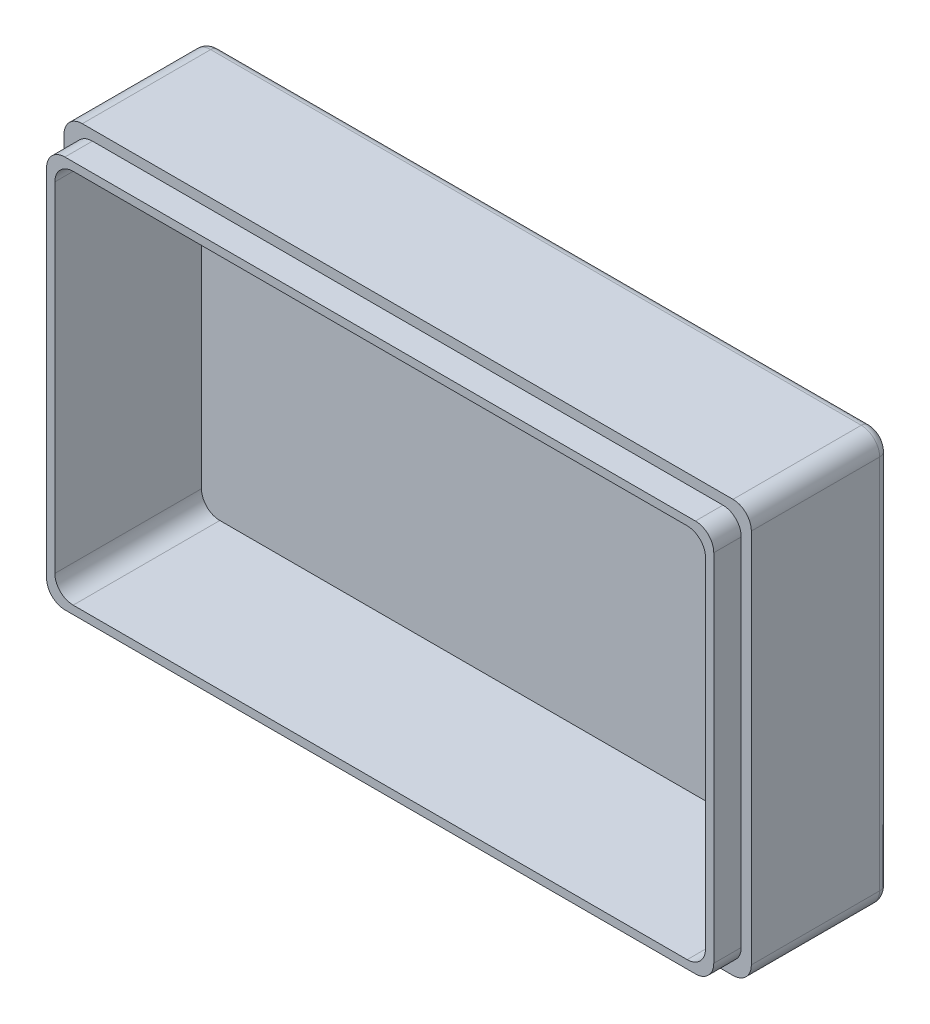
ISO-10303-21;
HEADER;
FILE_DESCRIPTION(('STEP AP214'),'2;1');
FILE_NAME('part.step','',(''),(''),'','','');
FILE_SCHEMA(('AUTOMOTIVE_DESIGN { 1 0 10303 214 1 1 1 1 }'));
ENDSEC;
DATA;
#1=APPLICATION_CONTEXT('core data for automotive mechanical design processes');
#2=APPLICATION_PROTOCOL_DEFINITION('international standard','automotive_design',2000,#1);
#3=PRODUCT_CONTEXT('',#1,'mechanical');
#4=PRODUCT('Part','Part','',(#3));
#5=PRODUCT_RELATED_PRODUCT_CATEGORY('part','',(#4));
#6=PRODUCT_DEFINITION_FORMATION('','',#4);
#7=PRODUCT_DEFINITION_CONTEXT('part definition',#1,'design');
#8=PRODUCT_DEFINITION('design','',#6,#7);
#9=PRODUCT_DEFINITION_SHAPE('','',#8);
#10=(LENGTH_UNIT() NAMED_UNIT(*) SI_UNIT(.MILLI.,.METRE.));
#11=(NAMED_UNIT(*) PLANE_ANGLE_UNIT() SI_UNIT($,.RADIAN.));
#12=(NAMED_UNIT(*) SI_UNIT($,.STERADIAN.) SOLID_ANGLE_UNIT());
#13=UNCERTAINTY_MEASURE_WITH_UNIT(LENGTH_MEASURE(1.E-05),#10,'distance_accuracy_value','');
#14=(GEOMETRIC_REPRESENTATION_CONTEXT(3) GLOBAL_UNCERTAINTY_ASSIGNED_CONTEXT((#13)) GLOBAL_UNIT_ASSIGNED_CONTEXT((#10,
#11,#12)) REPRESENTATION_CONTEXT('',''));
#15=CARTESIAN_POINT('',(0.,0.,0.));
#16=DIRECTION('',(0.,0.,1.));
#17=DIRECTION('',(1.,0.,0.));
#18=AXIS2_PLACEMENT_3D('',#15,#16,#17);
#19=CARTESIAN_POINT('',(0.,0.,18.));
#20=DIRECTION('',(0.,0.,1.));
#21=DIRECTION('',(1.,0.,0.));
#22=AXIS2_PLACEMENT_3D('',#19,#20,#21);
#23=PLANE('',#22);
#24=DIRECTION('',(-1.,0.,0.));
#25=VECTOR('',#24,1.);
#26=CARTESIAN_POINT('',(35.5,20.5,18.));
#27=LINE('',#26,#25);
#28=CARTESIAN_POINT('',(33.5,20.5,18.));
#29=VERTEX_POINT('',#28);
#30=CARTESIAN_POINT('',(-33.5,20.5,18.));
#31=VERTEX_POINT('',#30);
#32=EDGE_CURVE('E242',#29,#31,#27,.T.);
#33=ORIENTED_EDGE('',*,*,#32,.F.);
#34=CARTESIAN_POINT('',(33.5,18.5,18.));
#35=DIRECTION('',(0.,0.,1.));
#36=DIRECTION('',(1.,0.,0.));
#37=AXIS2_PLACEMENT_3D('',#34,#35,#36);
#38=CIRCLE('',#37,2.);
#39=CARTESIAN_POINT('',(35.5,18.5,18.));
#40=VERTEX_POINT('',#39);
#41=EDGE_CURVE('E225',#29,#40,#38,.F.);
#42=ORIENTED_EDGE('',*,*,#41,.T.);
#43=DIRECTION('',(0.,1.,0.));
#44=VECTOR('',#43,1.);
#45=CARTESIAN_POINT('',(35.5,-20.5,18.));
#46=LINE('',#45,#44);
#47=CARTESIAN_POINT('',(35.5,-18.5,18.));
#48=VERTEX_POINT('',#47);
#49=EDGE_CURVE('E266',#48,#40,#46,.T.);
#50=ORIENTED_EDGE('',*,*,#49,.F.);
#51=CARTESIAN_POINT('',(33.5,-18.5,18.));
#52=DIRECTION('',(0.,0.,1.));
#53=DIRECTION('',(1.,0.,0.));
#54=AXIS2_PLACEMENT_3D('',#51,#52,#53);
#55=CIRCLE('',#54,2.);
#56=CARTESIAN_POINT('',(33.5,-20.5,18.));
#57=VERTEX_POINT('',#56);
#58=EDGE_CURVE('E346',#48,#57,#55,.F.);
#59=ORIENTED_EDGE('',*,*,#58,.T.);
#60=DIRECTION('',(1.,0.,0.));
#61=VECTOR('',#60,1.);
#62=CARTESIAN_POINT('',(-35.5,-20.5,18.));
#63=LINE('',#62,#61);
#64=CARTESIAN_POINT('',(-33.5,-20.5,18.));
#65=VERTEX_POINT('',#64);
#66=EDGE_CURVE('E255',#65,#57,#63,.T.);
#67=ORIENTED_EDGE('',*,*,#66,.F.);
#68=CARTESIAN_POINT('',(-33.5,-18.5,18.));
#69=DIRECTION('',(0.,0.,1.));
#70=DIRECTION('',(1.,0.,0.));
#71=AXIS2_PLACEMENT_3D('',#68,#69,#70);
#72=CIRCLE('',#71,2.);
#73=CARTESIAN_POINT('',(-35.5,-18.5,18.));
#74=VERTEX_POINT('',#73);
#75=EDGE_CURVE('E344',#65,#74,#72,.F.);
#76=ORIENTED_EDGE('',*,*,#75,.T.);
#77=DIRECTION('',(0.,-1.,0.));
#78=VECTOR('',#77,1.);
#79=CARTESIAN_POINT('',(-35.5,20.5,18.));
#80=LINE('',#79,#78);
#81=CARTESIAN_POINT('',(-35.5,18.5,18.));
#82=VERTEX_POINT('',#81);
#83=EDGE_CURVE('E251',#82,#74,#80,.T.);
#84=ORIENTED_EDGE('',*,*,#83,.F.);
#85=CARTESIAN_POINT('',(-33.5,18.5,18.));
#86=DIRECTION('',(0.,0.,1.));
#87=DIRECTION('',(1.,0.,0.));
#88=AXIS2_PLACEMENT_3D('',#85,#86,#87);
#89=CIRCLE('',#88,2.);
#90=EDGE_CURVE('E235',#82,#31,#89,.F.);
#91=ORIENTED_EDGE('',*,*,#90,.T.);
#92=EDGE_LOOP('',(#33,#42,#50,#59,#67,#76,#84,#91));
#93=FACE_BOUND('',#92,.T.);
#94=DIRECTION('',(0.,1.,0.));
#95=VECTOR('',#94,1.);
#96=CARTESIAN_POINT('',(36.4,-21.4,18.));
#97=LINE('',#96,#95);
#98=CARTESIAN_POINT('',(36.4,-19.4,18.));
#99=VERTEX_POINT('',#98);
#100=CARTESIAN_POINT('',(36.4,19.4,18.));
#101=VERTEX_POINT('',#100);
#102=EDGE_CURVE('E417',#99,#101,#97,.T.);
#103=ORIENTED_EDGE('',*,*,#102,.T.);
#104=CARTESIAN_POINT('',(34.4,19.4,18.));
#105=DIRECTION('',(0.,0.,1.));
#106=DIRECTION('',(1.,0.,0.));
#107=AXIS2_PLACEMENT_3D('',#104,#105,#106);
#108=CIRCLE('',#107,2.);
#109=CARTESIAN_POINT('',(34.4,21.4,18.));
#110=VERTEX_POINT('',#109);
#111=EDGE_CURVE('E301',#101,#110,#108,.T.);
#112=ORIENTED_EDGE('',*,*,#111,.T.);
#113=DIRECTION('',(-1.,0.,0.));
#114=VECTOR('',#113,1.);
#115=CARTESIAN_POINT('',(36.4,21.4,18.));
#116=LINE('',#115,#114);
#117=CARTESIAN_POINT('',(-34.4,21.4,18.));
#118=VERTEX_POINT('',#117);
#119=EDGE_CURVE('E425',#110,#118,#116,.T.);
#120=ORIENTED_EDGE('',*,*,#119,.T.);
#121=CARTESIAN_POINT('',(-34.4,19.4,18.));
#122=DIRECTION('',(0.,0.,1.));
#123=DIRECTION('',(1.,0.,0.));
#124=AXIS2_PLACEMENT_3D('',#121,#122,#123);
#125=CIRCLE('',#124,2.);
#126=CARTESIAN_POINT('',(-36.4,19.4,18.));
#127=VERTEX_POINT('',#126);
#128=EDGE_CURVE('E295',#118,#127,#125,.T.);
#129=ORIENTED_EDGE('',*,*,#128,.T.);
#130=DIRECTION('',(0.,-1.,0.));
#131=VECTOR('',#130,1.);
#132=CARTESIAN_POINT('',(-36.4,21.4,18.));
#133=LINE('',#132,#131);
#134=CARTESIAN_POINT('',(-36.4,-19.4,18.));
#135=VERTEX_POINT('',#134);
#136=EDGE_CURVE('E407',#127,#135,#133,.T.);
#137=ORIENTED_EDGE('',*,*,#136,.T.);
#138=CARTESIAN_POINT('',(-34.4,-19.4,18.));
#139=DIRECTION('',(0.,0.,1.));
#140=DIRECTION('',(1.,0.,0.));
#141=AXIS2_PLACEMENT_3D('',#138,#139,#140);
#142=CIRCLE('',#141,2.);
#143=CARTESIAN_POINT('',(-34.4,-21.4,18.));
#144=VERTEX_POINT('',#143);
#145=EDGE_CURVE('E297',#135,#144,#142,.T.);
#146=ORIENTED_EDGE('',*,*,#145,.T.);
#147=DIRECTION('',(1.,0.,0.));
#148=VECTOR('',#147,1.);
#149=CARTESIAN_POINT('',(-36.4,-21.4,18.));
#150=LINE('',#149,#148);
#151=CARTESIAN_POINT('',(34.4,-21.4,18.));
#152=VERTEX_POINT('',#151);
#153=EDGE_CURVE('E413',#144,#152,#150,.T.);
#154=ORIENTED_EDGE('',*,*,#153,.T.);
#155=CARTESIAN_POINT('',(34.4,-19.4,18.));
#156=DIRECTION('',(0.,0.,1.));
#157=DIRECTION('',(1.,0.,0.));
#158=AXIS2_PLACEMENT_3D('',#155,#156,#157);
#159=CIRCLE('',#158,2.);
#160=EDGE_CURVE('E299',#152,#99,#159,.T.);
#161=ORIENTED_EDGE('',*,*,#160,.T.);
#162=EDGE_LOOP('',(#103,#112,#120,#129,#137,#146,#154,#161));
#163=FACE_BOUND('',#162,.T.);
#164=ADVANCED_FACE('F38',(#93,#163),#23,.T.);
#165=CARTESIAN_POINT('',(35.5,20.5,2.));
#166=DIRECTION('',(0.,1.,0.));
#167=DIRECTION('',(0.,0.,1.));
#168=AXIS2_PLACEMENT_3D('',#165,#166,#167);
#169=PLANE('',#168);
#170=DIRECTION('',(-1.,0.,0.));
#171=VECTOR('',#170,1.);
#172=CARTESIAN_POINT('',(35.5,20.5,2.));
#173=LINE('',#172,#171);
#174=CARTESIAN_POINT('',(33.5,20.5,2.));
#175=VERTEX_POINT('',#174);
#176=CARTESIAN_POINT('',(-33.5,20.5,2.));
#177=VERTEX_POINT('',#176);
#178=EDGE_CURVE('E245',#175,#177,#173,.T.);
#179=ORIENTED_EDGE('',*,*,#178,.F.);
#180=DIRECTION('',(0.,0.,1.));
#181=VECTOR('',#180,1.);
#182=CARTESIAN_POINT('',(33.5,20.5,18.));
#183=LINE('',#182,#181);
#184=EDGE_CURVE('E229',#175,#29,#183,.T.);
#185=ORIENTED_EDGE('',*,*,#184,.T.);
#186=ORIENTED_EDGE('',*,*,#32,.T.);
#187=DIRECTION('',(0.,0.,1.));
#188=VECTOR('',#187,1.);
#189=CARTESIAN_POINT('',(-33.5,20.5,2.));
#190=LINE('',#189,#188);
#191=EDGE_CURVE('E247',#31,#177,#190,.F.);
#192=ORIENTED_EDGE('',*,*,#191,.T.);
#193=EDGE_LOOP('',(#179,#185,#186,#192));
#194=FACE_BOUND('',#193,.T.);
#195=ADVANCED_FACE('F241',(#194),#169,.F.);
#196=CARTESIAN_POINT('',(35.5,-20.5,2.));
#197=DIRECTION('',(1.,0.,0.));
#198=DIRECTION('',(0.,0.,-1.));
#199=AXIS2_PLACEMENT_3D('',#196,#197,#198);
#200=PLANE('',#199);
#201=ORIENTED_EDGE('',*,*,#49,.T.);
#202=DIRECTION('',(0.,0.,1.));
#203=VECTOR('',#202,1.);
#204=CARTESIAN_POINT('',(35.5,18.5,2.));
#205=LINE('',#204,#203);
#206=CARTESIAN_POINT('',(35.5,18.5,2.));
#207=VERTEX_POINT('',#206);
#208=EDGE_CURVE('E230',#40,#207,#205,.F.);
#209=ORIENTED_EDGE('',*,*,#208,.T.);
#210=DIRECTION('',(0.,1.,0.));
#211=VECTOR('',#210,1.);
#212=CARTESIAN_POINT('',(35.5,-20.5,2.));
#213=LINE('',#212,#211);
#214=CARTESIAN_POINT('',(35.5,-18.5,2.));
#215=VERTEX_POINT('',#214);
#216=EDGE_CURVE('E261',#215,#207,#213,.T.);
#217=ORIENTED_EDGE('',*,*,#216,.F.);
#218=DIRECTION('',(0.,0.,1.));
#219=VECTOR('',#218,1.);
#220=CARTESIAN_POINT('',(35.5,-18.5,18.));
#221=LINE('',#220,#219);
#222=EDGE_CURVE('E246',#215,#48,#221,.T.);
#223=ORIENTED_EDGE('',*,*,#222,.T.);
#224=EDGE_LOOP('',(#201,#209,#217,#223));
#225=FACE_BOUND('',#224,.T.);
#226=ADVANCED_FACE('F450',(#225),#200,.F.);
#227=CARTESIAN_POINT('',(-35.5,-20.5,2.));
#228=DIRECTION('',(0.,-1.,0.));
#229=DIRECTION('',(0.,0.,-1.));
#230=AXIS2_PLACEMENT_3D('',#227,#228,#229);
#231=PLANE('',#230);
#232=DIRECTION('',(1.,0.,0.));
#233=VECTOR('',#232,1.);
#234=CARTESIAN_POINT('',(-35.5,-20.5,2.));
#235=LINE('',#234,#233);
#236=CARTESIAN_POINT('',(-33.5,-20.5,2.));
#237=VERTEX_POINT('',#236);
#238=CARTESIAN_POINT('',(33.5,-20.5,2.));
#239=VERTEX_POINT('',#238);
#240=EDGE_CURVE('E440',#237,#239,#235,.T.);
#241=ORIENTED_EDGE('',*,*,#240,.F.);
#242=DIRECTION('',(0.,0.,1.));
#243=VECTOR('',#242,1.);
#244=CARTESIAN_POINT('',(-33.5,-20.5,18.));
#245=LINE('',#244,#243);
#246=EDGE_CURVE('E287',#237,#65,#245,.T.);
#247=ORIENTED_EDGE('',*,*,#246,.T.);
#248=ORIENTED_EDGE('',*,*,#66,.T.);
#249=DIRECTION('',(0.,0.,1.));
#250=VECTOR('',#249,1.);
#251=CARTESIAN_POINT('',(33.5,-20.5,2.));
#252=LINE('',#251,#250);
#253=EDGE_CURVE('E285',#57,#239,#252,.F.);
#254=ORIENTED_EDGE('',*,*,#253,.T.);
#255=EDGE_LOOP('',(#241,#247,#248,#254));
#256=FACE_BOUND('',#255,.T.);
#257=ADVANCED_FACE('F456',(#256),#231,.F.);
#258=CARTESIAN_POINT('',(-35.5,20.5,2.));
#259=DIRECTION('',(-1.,0.,0.));
#260=DIRECTION('',(0.,0.,1.));
#261=AXIS2_PLACEMENT_3D('',#258,#259,#260);
#262=PLANE('',#261);
#263=DIRECTION('',(0.,-1.,0.));
#264=VECTOR('',#263,1.);
#265=CARTESIAN_POINT('',(-35.5,20.5,2.));
#266=LINE('',#265,#264);
#267=CARTESIAN_POINT('',(-35.5,18.5,2.));
#268=VERTEX_POINT('',#267);
#269=CARTESIAN_POINT('',(-35.5,-18.5,2.));
#270=VERTEX_POINT('',#269);
#271=EDGE_CURVE('E438',#268,#270,#266,.T.);
#272=ORIENTED_EDGE('',*,*,#271,.F.);
#273=DIRECTION('',(0.,0.,1.));
#274=VECTOR('',#273,1.);
#275=CARTESIAN_POINT('',(-35.5,18.5,18.));
#276=LINE('',#275,#274);
#277=EDGE_CURVE('E282',#268,#82,#276,.T.);
#278=ORIENTED_EDGE('',*,*,#277,.T.);
#279=ORIENTED_EDGE('',*,*,#83,.T.);
#280=DIRECTION('',(0.,0.,1.));
#281=VECTOR('',#280,1.);
#282=CARTESIAN_POINT('',(-35.5,-18.5,2.));
#283=LINE('',#282,#281);
#284=EDGE_CURVE('E280',#74,#270,#283,.F.);
#285=ORIENTED_EDGE('',*,*,#284,.T.);
#286=EDGE_LOOP('',(#272,#278,#279,#285));
#287=FACE_BOUND('',#286,.T.);
#288=ADVANCED_FACE('F464',(#287),#262,.F.);
#289=CARTESIAN_POINT('',(0.,0.,2.));
#290=DIRECTION('',(0.,0.,1.));
#291=DIRECTION('',(1.,0.,0.));
#292=AXIS2_PLACEMENT_3D('',#289,#290,#291);
#293=PLANE('',#292);
#294=ORIENTED_EDGE('',*,*,#216,.T.);
#295=CARTESIAN_POINT('',(33.5,18.5,2.));
#296=DIRECTION('',(0.,0.,1.));
#297=DIRECTION('',(1.,0.,0.));
#298=AXIS2_PLACEMENT_3D('',#295,#296,#297);
#299=CIRCLE('',#298,2.);
#300=EDGE_CURVE('E278',#207,#175,#299,.T.);
#301=ORIENTED_EDGE('',*,*,#300,.T.);
#302=ORIENTED_EDGE('',*,*,#178,.T.);
#303=CARTESIAN_POINT('',(-33.5,18.5,2.));
#304=DIRECTION('',(0.,0.,1.));
#305=DIRECTION('',(1.,0.,0.));
#306=AXIS2_PLACEMENT_3D('',#303,#304,#305);
#307=CIRCLE('',#306,2.);
#308=EDGE_CURVE('E276',#177,#268,#307,.T.);
#309=ORIENTED_EDGE('',*,*,#308,.T.);
#310=ORIENTED_EDGE('',*,*,#271,.T.);
#311=CARTESIAN_POINT('',(-33.5,-18.5,2.));
#312=DIRECTION('',(0.,0.,1.));
#313=DIRECTION('',(1.,0.,0.));
#314=AXIS2_PLACEMENT_3D('',#311,#312,#313);
#315=CIRCLE('',#314,2.);
#316=EDGE_CURVE('E274',#270,#237,#315,.T.);
#317=ORIENTED_EDGE('',*,*,#316,.T.);
#318=ORIENTED_EDGE('',*,*,#240,.T.);
#319=CARTESIAN_POINT('',(33.5,-18.5,2.));
#320=DIRECTION('',(0.,0.,1.));
#321=DIRECTION('',(1.,0.,0.));
#322=AXIS2_PLACEMENT_3D('',#319,#320,#321);
#323=CIRCLE('',#322,2.);
#324=EDGE_CURVE('E272',#239,#215,#323,.T.);
#325=ORIENTED_EDGE('',*,*,#324,.T.);
#326=EDGE_LOOP('',(#294,#301,#302,#309,#310,#317,#318,#325));
#327=FACE_BOUND('',#326,.T.);
#328=ADVANCED_FACE('F447',(#327),#293,.T.);
#329=CARTESIAN_POINT('',(0.,0.,15.));
#330=DIRECTION('',(0.,0.,1.));
#331=DIRECTION('',(1.,0.,0.));
#332=AXIS2_PLACEMENT_3D('',#329,#330,#331);
#333=PLANE('',#332);
#334=DIRECTION('',(-1.,0.,0.));
#335=VECTOR('',#334,1.);
#336=CARTESIAN_POINT('',(36.4,21.4,15.));
#337=LINE('',#336,#335);
#338=CARTESIAN_POINT('',(34.4,21.4,15.));
#339=VERTEX_POINT('',#338);
#340=CARTESIAN_POINT('',(-34.4,21.4,15.));
#341=VERTEX_POINT('',#340);
#342=EDGE_CURVE('E420',#339,#341,#337,.T.);
#343=ORIENTED_EDGE('',*,*,#342,.F.);
#344=CARTESIAN_POINT('',(34.4,19.4,15.));
#345=DIRECTION('',(0.,0.,1.));
#346=DIRECTION('',(1.,0.,0.));
#347=AXIS2_PLACEMENT_3D('',#344,#345,#346);
#348=CIRCLE('',#347,2.);
#349=CARTESIAN_POINT('',(36.4,19.4,15.));
#350=VERTEX_POINT('',#349);
#351=EDGE_CURVE('E348',#339,#350,#348,.F.);
#352=ORIENTED_EDGE('',*,*,#351,.T.);
#353=DIRECTION('',(0.,1.,0.));
#354=VECTOR('',#353,1.);
#355=CARTESIAN_POINT('',(36.4,-21.4,15.));
#356=LINE('',#355,#354);
#357=CARTESIAN_POINT('',(36.4,-19.4,15.));
#358=VERTEX_POINT('',#357);
#359=EDGE_CURVE('E849',#358,#350,#356,.T.);
#360=ORIENTED_EDGE('',*,*,#359,.F.);
#361=CARTESIAN_POINT('',(34.4,-19.4,15.));
#362=DIRECTION('',(0.,0.,1.));
#363=DIRECTION('',(1.,0.,0.));
#364=AXIS2_PLACEMENT_3D('',#361,#362,#363);
#365=CIRCLE('',#364,2.);
#366=CARTESIAN_POINT('',(34.4,-21.4,15.));
#367=VERTEX_POINT('',#366);
#368=EDGE_CURVE('E350',#358,#367,#365,.F.);
#369=ORIENTED_EDGE('',*,*,#368,.T.);
#370=DIRECTION('',(1.,0.,0.));
#371=VECTOR('',#370,1.);
#372=CARTESIAN_POINT('',(-36.4,-21.4,15.));
#373=LINE('',#372,#371);
#374=CARTESIAN_POINT('',(-34.4,-21.4,15.));
#375=VERTEX_POINT('',#374);
#376=EDGE_CURVE('E861',#375,#367,#373,.T.);
#377=ORIENTED_EDGE('',*,*,#376,.F.);
#378=CARTESIAN_POINT('',(-34.4,-19.4,15.));
#379=DIRECTION('',(0.,0.,1.));
#380=DIRECTION('',(1.,0.,0.));
#381=AXIS2_PLACEMENT_3D('',#378,#379,#380);
#382=CIRCLE('',#381,2.);
#383=CARTESIAN_POINT('',(-36.4,-19.4,15.));
#384=VERTEX_POINT('',#383);
#385=EDGE_CURVE('E352',#375,#384,#382,.F.);
#386=ORIENTED_EDGE('',*,*,#385,.T.);
#387=DIRECTION('',(0.,-1.,0.));
#388=VECTOR('',#387,1.);
#389=CARTESIAN_POINT('',(-36.4,21.4,15.));
#390=LINE('',#389,#388);
#391=CARTESIAN_POINT('',(-36.4,19.4,15.));
#392=VERTEX_POINT('',#391);
#393=EDGE_CURVE('E428',#392,#384,#390,.T.);
#394=ORIENTED_EDGE('',*,*,#393,.F.);
#395=CARTESIAN_POINT('',(-34.4,19.4,15.));
#396=DIRECTION('',(0.,0.,1.));
#397=DIRECTION('',(1.,0.,0.));
#398=AXIS2_PLACEMENT_3D('',#395,#396,#397);
#399=CIRCLE('',#398,2.);
#400=EDGE_CURVE('E354',#392,#341,#399,.F.);
#401=ORIENTED_EDGE('',*,*,#400,.T.);
#402=EDGE_LOOP('',(#343,#352,#360,#369,#377,#386,#394,#401));
#403=FACE_BOUND('',#402,.T.);
#404=DIRECTION('',(0.,1.,0.));
#405=VECTOR('',#404,1.);
#406=CARTESIAN_POINT('',(37.5,-22.5,15.));
#407=LINE('',#406,#405);
#408=CARTESIAN_POINT('',(37.5,-20.5,15.));
#409=VERTEX_POINT('',#408);
#410=CARTESIAN_POINT('',(37.5,20.5,15.));
#411=VERTEX_POINT('',#410);
#412=EDGE_CURVE('E258',#409,#411,#407,.T.);
#413=ORIENTED_EDGE('',*,*,#412,.T.);
#414=CARTESIAN_POINT('',(35.5,20.5,15.));
#415=DIRECTION('',(0.,0.,1.));
#416=DIRECTION('',(1.,0.,0.));
#417=AXIS2_PLACEMENT_3D('',#414,#415,#416);
#418=CIRCLE('',#417,2.);
#419=CARTESIAN_POINT('',(35.5,22.5,15.));
#420=VERTEX_POINT('',#419);
#421=EDGE_CURVE('E322',#411,#420,#418,.T.);
#422=ORIENTED_EDGE('',*,*,#421,.T.);
#423=DIRECTION('',(-1.,0.,0.));
#424=VECTOR('',#423,1.);
#425=CARTESIAN_POINT('',(37.5,22.5,15.));
#426=LINE('',#425,#424);
#427=CARTESIAN_POINT('',(-35.5,22.5,15.));
#428=VERTEX_POINT('',#427);
#429=EDGE_CURVE('E252',#420,#428,#426,.T.);
#430=ORIENTED_EDGE('',*,*,#429,.T.);
#431=CARTESIAN_POINT('',(-35.5,20.5,15.));
#432=DIRECTION('',(0.,0.,1.));
#433=DIRECTION('',(1.,0.,0.));
#434=AXIS2_PLACEMENT_3D('',#431,#432,#433);
#435=CIRCLE('',#434,2.);
#436=CARTESIAN_POINT('',(-37.5,20.5,15.));
#437=VERTEX_POINT('',#436);
#438=EDGE_CURVE('E316',#428,#437,#435,.T.);
#439=ORIENTED_EDGE('',*,*,#438,.T.);
#440=DIRECTION('',(0.,-1.,0.));
#441=VECTOR('',#440,1.);
#442=CARTESIAN_POINT('',(-37.5,22.5,15.));
#443=LINE('',#442,#441);
#444=CARTESIAN_POINT('',(-37.5,-20.5,15.));
#445=VERTEX_POINT('',#444);
#446=EDGE_CURVE('E429',#437,#445,#443,.T.);
#447=ORIENTED_EDGE('',*,*,#446,.T.);
#448=CARTESIAN_POINT('',(-35.5,-20.5,15.));
#449=DIRECTION('',(0.,0.,1.));
#450=DIRECTION('',(1.,0.,0.));
#451=AXIS2_PLACEMENT_3D('',#448,#449,#450);
#452=CIRCLE('',#451,2.);
#453=CARTESIAN_POINT('',(-35.5,-22.5,15.));
#454=VERTEX_POINT('',#453);
#455=EDGE_CURVE('E318',#445,#454,#452,.T.);
#456=ORIENTED_EDGE('',*,*,#455,.T.);
#457=DIRECTION('',(1.,0.,0.));
#458=VECTOR('',#457,1.);
#459=CARTESIAN_POINT('',(-37.5,-22.5,15.));
#460=LINE('',#459,#458);
#461=CARTESIAN_POINT('',(35.5,-22.5,15.));
#462=VERTEX_POINT('',#461);
#463=EDGE_CURVE('E432',#454,#462,#460,.T.);
#464=ORIENTED_EDGE('',*,*,#463,.T.);
#465=CARTESIAN_POINT('',(35.5,-20.5,15.));
#466=DIRECTION('',(0.,0.,1.));
#467=DIRECTION('',(1.,0.,0.));
#468=AXIS2_PLACEMENT_3D('',#465,#466,#467);
#469=CIRCLE('',#468,2.);
#470=EDGE_CURVE('E320',#462,#409,#469,.T.);
#471=ORIENTED_EDGE('',*,*,#470,.T.);
#472=EDGE_LOOP('',(#413,#422,#430,#439,#447,#456,#464,#471));
#473=FACE_BOUND('',#472,.T.);
#474=ADVANCED_FACE('F552',(#403,#473),#333,.T.);
#475=CARTESIAN_POINT('',(-36.4,21.4,15.));
#476=DIRECTION('',(-1.,0.,0.));
#477=DIRECTION('',(0.,-1.,0.));
#478=AXIS2_PLACEMENT_3D('',#475,#476,#477);
#479=PLANE('',#478);
#480=ORIENTED_EDGE('',*,*,#393,.T.);
#481=DIRECTION('',(0.,0.,1.));
#482=VECTOR('',#481,1.);
#483=CARTESIAN_POINT('',(-36.4,-19.4,15.));
#484=LINE('',#483,#482);
#485=EDGE_CURVE('E336',#384,#135,#484,.T.);
#486=ORIENTED_EDGE('',*,*,#485,.T.);
#487=ORIENTED_EDGE('',*,*,#136,.F.);
#488=DIRECTION('',(0.,0.,1.));
#489=VECTOR('',#488,1.);
#490=CARTESIAN_POINT('',(-36.4,19.4,15.));
#491=LINE('',#490,#489);
#492=EDGE_CURVE('E334',#127,#392,#491,.F.);
#493=ORIENTED_EDGE('',*,*,#492,.T.);
#494=EDGE_LOOP('',(#480,#486,#487,#493));
#495=FACE_BOUND('',#494,.T.);
#496=ADVANCED_FACE('F749',(#495),#479,.T.);
#497=CARTESIAN_POINT('',(36.4,21.4,15.));
#498=DIRECTION('',(0.,1.,0.));
#499=DIRECTION('',(-1.,0.,0.));
#500=AXIS2_PLACEMENT_3D('',#497,#498,#499);
#501=PLANE('',#500);
#502=ORIENTED_EDGE('',*,*,#119,.F.);
#503=DIRECTION('',(0.,0.,1.));
#504=VECTOR('',#503,1.);
#505=CARTESIAN_POINT('',(34.4,21.4,15.));
#506=LINE('',#505,#504);
#507=EDGE_CURVE('E306',#110,#339,#506,.F.);
#508=ORIENTED_EDGE('',*,*,#507,.T.);
#509=ORIENTED_EDGE('',*,*,#342,.T.);
#510=DIRECTION('',(0.,0.,1.));
#511=VECTOR('',#510,1.);
#512=CARTESIAN_POINT('',(-34.4,21.4,15.));
#513=LINE('',#512,#511);
#514=EDGE_CURVE('E303',#341,#118,#513,.T.);
#515=ORIENTED_EDGE('',*,*,#514,.T.);
#516=EDGE_LOOP('',(#502,#508,#509,#515));
#517=FACE_BOUND('',#516,.T.);
#518=ADVANCED_FACE('F740',(#517),#501,.T.);
#519=CARTESIAN_POINT('',(36.4,-21.4,15.));
#520=DIRECTION('',(1.,0.,0.));
#521=DIRECTION('',(0.,0.,-1.));
#522=AXIS2_PLACEMENT_3D('',#519,#520,#521);
#523=PLANE('',#522);
#524=ORIENTED_EDGE('',*,*,#359,.T.);
#525=DIRECTION('',(0.,0.,1.));
#526=VECTOR('',#525,1.);
#527=CARTESIAN_POINT('',(36.4,19.4,15.));
#528=LINE('',#527,#526);
#529=EDGE_CURVE('E292',#350,#101,#528,.T.);
#530=ORIENTED_EDGE('',*,*,#529,.T.);
#531=ORIENTED_EDGE('',*,*,#102,.F.);
#532=DIRECTION('',(0.,0.,1.));
#533=VECTOR('',#532,1.);
#534=CARTESIAN_POINT('',(36.4,-19.4,15.));
#535=LINE('',#534,#533);
#536=EDGE_CURVE('E290',#99,#358,#535,.F.);
#537=ORIENTED_EDGE('',*,*,#536,.T.);
#538=EDGE_LOOP('',(#524,#530,#531,#537));
#539=FACE_BOUND('',#538,.T.);
#540=ADVANCED_FACE('F731',(#539),#523,.T.);
#541=CARTESIAN_POINT('',(-36.4,-21.4,15.));
#542=DIRECTION('',(0.,-1.,0.));
#543=DIRECTION('',(1.,0.,0.));
#544=AXIS2_PLACEMENT_3D('',#541,#542,#543);
#545=PLANE('',#544);
#546=ORIENTED_EDGE('',*,*,#376,.T.);
#547=DIRECTION('',(0.,0.,1.));
#548=VECTOR('',#547,1.);
#549=CARTESIAN_POINT('',(34.4,-21.4,15.));
#550=LINE('',#549,#548);
#551=EDGE_CURVE('E326',#367,#152,#550,.T.);
#552=ORIENTED_EDGE('',*,*,#551,.T.);
#553=ORIENTED_EDGE('',*,*,#153,.F.);
#554=DIRECTION('',(0.,0.,1.));
#555=VECTOR('',#554,1.);
#556=CARTESIAN_POINT('',(-34.4,-21.4,15.));
#557=LINE('',#556,#555);
#558=EDGE_CURVE('E324',#144,#375,#557,.F.);
#559=ORIENTED_EDGE('',*,*,#558,.T.);
#560=EDGE_LOOP('',(#546,#552,#553,#559));
#561=FACE_BOUND('',#560,.T.);
#562=ADVANCED_FACE('F490',(#561),#545,.T.);
#563=CARTESIAN_POINT('',(0.,0.,0.));
#564=DIRECTION('',(0.,0.,1.));
#565=DIRECTION('',(1.,0.,0.));
#566=AXIS2_PLACEMENT_3D('',#563,#564,#565);
#567=PLANE('',#566);
#568=DIRECTION('',(0.,-1.,0.));
#569=VECTOR('',#568,1.);
#570=CARTESIAN_POINT('',(-36.5,0.,0.));
#571=LINE('',#570,#569);
#572=CARTESIAN_POINT('',(-36.5,-20.5,0.));
#573=VERTEX_POINT('',#572);
#574=CARTESIAN_POINT('',(-36.5,20.5,0.));
#575=VERTEX_POINT('',#574);
#576=EDGE_CURVE('E368',#573,#575,#571,.F.);
#577=ORIENTED_EDGE('',*,*,#576,.T.);
#578=CARTESIAN_POINT('',(-35.5,20.5,0.));
#579=DIRECTION('',(0.,0.,1.));
#580=DIRECTION('',(1.,0.,0.));
#581=AXIS2_PLACEMENT_3D('',#578,#579,#580);
#582=CIRCLE('',#581,1.);
#583=CARTESIAN_POINT('',(-35.5,21.5,0.));
#584=VERTEX_POINT('',#583);
#585=EDGE_CURVE('E370',#575,#584,#582,.F.);
#586=ORIENTED_EDGE('',*,*,#585,.T.);
#587=DIRECTION('',(-1.,0.,0.));
#588=VECTOR('',#587,1.);
#589=CARTESIAN_POINT('',(0.,21.5,0.));
#590=LINE('',#589,#588);
#591=CARTESIAN_POINT('',(35.5,21.5,0.));
#592=VERTEX_POINT('',#591);
#593=EDGE_CURVE('E356',#584,#592,#590,.F.);
#594=ORIENTED_EDGE('',*,*,#593,.T.);
#595=CARTESIAN_POINT('',(35.5,20.5,0.));
#596=DIRECTION('',(0.,0.,1.));
#597=DIRECTION('',(1.,0.,0.));
#598=AXIS2_PLACEMENT_3D('',#595,#596,#597);
#599=CIRCLE('',#598,1.);
#600=CARTESIAN_POINT('',(36.5,20.5,0.));
#601=VERTEX_POINT('',#600);
#602=EDGE_CURVE('E358',#592,#601,#599,.F.);
#603=ORIENTED_EDGE('',*,*,#602,.T.);
#604=DIRECTION('',(0.,1.,0.));
#605=VECTOR('',#604,1.);
#606=CARTESIAN_POINT('',(36.5,0.,0.));
#607=LINE('',#606,#605);
#608=CARTESIAN_POINT('',(36.5,-20.5,0.));
#609=VERTEX_POINT('',#608);
#610=EDGE_CURVE('E360',#601,#609,#607,.F.);
#611=ORIENTED_EDGE('',*,*,#610,.T.);
#612=CARTESIAN_POINT('',(35.5,-20.5,0.));
#613=DIRECTION('',(0.,0.,1.));
#614=DIRECTION('',(1.,0.,0.));
#615=AXIS2_PLACEMENT_3D('',#612,#613,#614);
#616=CIRCLE('',#615,1.);
#617=CARTESIAN_POINT('',(35.5,-21.5,0.));
#618=VERTEX_POINT('',#617);
#619=EDGE_CURVE('E362',#609,#618,#616,.F.);
#620=ORIENTED_EDGE('',*,*,#619,.T.);
#621=DIRECTION('',(1.,0.,0.));
#622=VECTOR('',#621,1.);
#623=CARTESIAN_POINT('',(0.,-21.5,0.));
#624=LINE('',#623,#622);
#625=CARTESIAN_POINT('',(-35.5,-21.5,0.));
#626=VERTEX_POINT('',#625);
#627=EDGE_CURVE('E364',#618,#626,#624,.F.);
#628=ORIENTED_EDGE('',*,*,#627,.T.);
#629=CARTESIAN_POINT('',(-35.5,-20.5,0.));
#630=DIRECTION('',(0.,0.,1.));
#631=DIRECTION('',(1.,0.,0.));
#632=AXIS2_PLACEMENT_3D('',#629,#630,#631);
#633=CIRCLE('',#632,1.);
#634=EDGE_CURVE('E366',#626,#573,#633,.F.);
#635=ORIENTED_EDGE('',*,*,#634,.T.);
#636=EDGE_LOOP('',(#577,#586,#594,#603,#611,#620,#628,#635));
#637=FACE_BOUND('',#636,.T.);
#638=ADVANCED_FACE('F486',(#637),#567,.F.);
#639=CARTESIAN_POINT('',(-37.5,22.5,18.));
#640=DIRECTION('',(0.,-1.,0.));
#641=DIRECTION('',(0.,0.,-1.));
#642=AXIS2_PLACEMENT_3D('',#639,#640,#641);
#643=PLANE('',#642);
#644=DIRECTION('',(0.,0.,-1.));
#645=VECTOR('',#644,1.);
#646=CARTESIAN_POINT('',(35.5,22.5,18.));
#647=LINE('',#646,#645);
#648=CARTESIAN_POINT('',(35.5,22.5,1.));
#649=VERTEX_POINT('',#648);
#650=EDGE_CURVE('E310',#420,#649,#647,.T.);
#651=ORIENTED_EDGE('',*,*,#650,.T.);
#652=DIRECTION('',(-1.,0.,0.));
#653=VECTOR('',#652,1.);
#654=CARTESIAN_POINT('',(-37.5,22.5,1.));
#655=LINE('',#654,#653);
#656=CARTESIAN_POINT('',(-35.5,22.5,1.));
#657=VERTEX_POINT('',#656);
#658=EDGE_CURVE('E11',#649,#657,#655,.T.);
#659=ORIENTED_EDGE('',*,*,#658,.T.);
#660=DIRECTION('',(0.,0.,-1.));
#661=VECTOR('',#660,1.);
#662=CARTESIAN_POINT('',(-35.5,22.5,18.));
#663=LINE('',#662,#661);
#664=EDGE_CURVE('E308',#657,#428,#663,.F.);
#665=ORIENTED_EDGE('',*,*,#664,.T.);
#666=ORIENTED_EDGE('',*,*,#429,.F.);
#667=EDGE_LOOP('',(#651,#659,#665,#666));
#668=FACE_BOUND('',#667,.T.);
#669=ADVANCED_FACE('F489',(#668),#643,.F.);
#670=CARTESIAN_POINT('',(37.5,22.5,18.));
#671=DIRECTION('',(-1.,0.,0.));
#672=DIRECTION('',(0.,-1.,0.));
#673=AXIS2_PLACEMENT_3D('',#670,#671,#672);
#674=PLANE('',#673);
#675=DIRECTION('',(0.,0.,-1.));
#676=VECTOR('',#675,1.);
#677=CARTESIAN_POINT('',(37.5,-20.5,18.));
#678=LINE('',#677,#676);
#679=CARTESIAN_POINT('',(37.5,-20.5,1.));
#680=VERTEX_POINT('',#679);
#681=EDGE_CURVE('E312',#409,#680,#678,.T.);
#682=ORIENTED_EDGE('',*,*,#681,.T.);
#683=DIRECTION('',(0.,1.,0.));
#684=VECTOR('',#683,1.);
#685=CARTESIAN_POINT('',(37.5,22.5,1.));
#686=LINE('',#685,#684);
#687=CARTESIAN_POINT('',(37.5,20.5,1.));
#688=VERTEX_POINT('',#687);
#689=EDGE_CURVE('E62',#680,#688,#686,.T.);
#690=ORIENTED_EDGE('',*,*,#689,.T.);
#691=DIRECTION('',(0.,0.,-1.));
#692=VECTOR('',#691,1.);
#693=CARTESIAN_POINT('',(37.5,20.5,18.));
#694=LINE('',#693,#692);
#695=EDGE_CURVE('E314',#688,#411,#694,.F.);
#696=ORIENTED_EDGE('',*,*,#695,.T.);
#697=ORIENTED_EDGE('',*,*,#412,.F.);
#698=EDGE_LOOP('',(#682,#690,#696,#697));
#699=FACE_BOUND('',#698,.T.);
#700=ADVANCED_FACE('F494',(#699),#674,.F.);
#701=CARTESIAN_POINT('',(-37.5,-22.5,18.));
#702=DIRECTION('',(0.,1.,0.));
#703=DIRECTION('',(0.,0.,1.));
#704=AXIS2_PLACEMENT_3D('',#701,#702,#703);
#705=PLANE('',#704);
#706=DIRECTION('',(0.,0.,-1.));
#707=VECTOR('',#706,1.);
#708=CARTESIAN_POINT('',(-35.5,-22.5,18.));
#709=LINE('',#708,#707);
#710=CARTESIAN_POINT('',(-35.5,-22.5,1.));
#711=VERTEX_POINT('',#710);
#712=EDGE_CURVE('E329',#454,#711,#709,.T.);
#713=ORIENTED_EDGE('',*,*,#712,.T.);
#714=DIRECTION('',(1.,0.,0.));
#715=VECTOR('',#714,1.);
#716=CARTESIAN_POINT('',(-37.5,-22.5,1.));
#717=LINE('',#716,#715);
#718=CARTESIAN_POINT('',(35.5,-22.5,1.));
#719=VERTEX_POINT('',#718);
#720=EDGE_CURVE('E380',#711,#719,#717,.T.);
#721=ORIENTED_EDGE('',*,*,#720,.T.);
#722=DIRECTION('',(0.,0.,-1.));
#723=VECTOR('',#722,1.);
#724=CARTESIAN_POINT('',(35.5,-22.5,18.));
#725=LINE('',#724,#723);
#726=EDGE_CURVE('E332',#719,#462,#725,.F.);
#727=ORIENTED_EDGE('',*,*,#726,.T.);
#728=ORIENTED_EDGE('',*,*,#463,.F.);
#729=EDGE_LOOP('',(#713,#721,#727,#728));
#730=FACE_BOUND('',#729,.T.);
#731=ADVANCED_FACE('F498',(#730),#705,.F.);
#732=CARTESIAN_POINT('',(-37.5,22.5,18.));
#733=DIRECTION('',(1.,0.,0.));
#734=DIRECTION('',(0.,1.,0.));
#735=AXIS2_PLACEMENT_3D('',#732,#733,#734);
#736=PLANE('',#735);
#737=DIRECTION('',(0.,0.,-1.));
#738=VECTOR('',#737,1.);
#739=CARTESIAN_POINT('',(-37.5,20.5,18.));
#740=LINE('',#739,#738);
#741=CARTESIAN_POINT('',(-37.5,20.5,1.));
#742=VERTEX_POINT('',#741);
#743=EDGE_CURVE('E339',#437,#742,#740,.T.);
#744=ORIENTED_EDGE('',*,*,#743,.T.);
#745=DIRECTION('',(0.,-1.,0.));
#746=VECTOR('',#745,1.);
#747=CARTESIAN_POINT('',(-37.5,22.5,1.));
#748=LINE('',#747,#746);
#749=CARTESIAN_POINT('',(-37.5,-20.5,1.));
#750=VERTEX_POINT('',#749);
#751=EDGE_CURVE('E376',#742,#750,#748,.T.);
#752=ORIENTED_EDGE('',*,*,#751,.T.);
#753=DIRECTION('',(0.,0.,-1.));
#754=VECTOR('',#753,1.);
#755=CARTESIAN_POINT('',(-37.5,-20.5,18.));
#756=LINE('',#755,#754);
#757=EDGE_CURVE('E236',#750,#445,#756,.F.);
#758=ORIENTED_EDGE('',*,*,#757,.T.);
#759=ORIENTED_EDGE('',*,*,#446,.F.);
#760=EDGE_LOOP('',(#744,#752,#758,#759));
#761=FACE_BOUND('',#760,.T.);
#762=ADVANCED_FACE('F476',(#761),#736,.F.);
#763=CARTESIAN_POINT('',(33.5,18.5,2.));
#764=DIRECTION('',(0.,0.,-1.));
#765=DIRECTION('',(-1.,0.,0.));
#766=AXIS2_PLACEMENT_3D('',#763,#764,#765);
#767=CYLINDRICAL_SURFACE('',#766,2.);
#768=ORIENTED_EDGE('',*,*,#300,.F.);
#769=ORIENTED_EDGE('',*,*,#208,.F.);
#770=ORIENTED_EDGE('',*,*,#41,.F.);
#771=ORIENTED_EDGE('',*,*,#184,.F.);
#772=EDGE_LOOP('',(#768,#769,#770,#771));
#773=FACE_BOUND('',#772,.T.);
#774=ADVANCED_FACE('F228',(#773),#767,.F.);
#775=CARTESIAN_POINT('',(-33.5,18.5,2.));
#776=DIRECTION('',(0.,0.,-1.));
#777=DIRECTION('',(-1.,0.,0.));
#778=AXIS2_PLACEMENT_3D('',#775,#776,#777);
#779=CYLINDRICAL_SURFACE('',#778,2.);
#780=ORIENTED_EDGE('',*,*,#308,.F.);
#781=ORIENTED_EDGE('',*,*,#191,.F.);
#782=ORIENTED_EDGE('',*,*,#90,.F.);
#783=ORIENTED_EDGE('',*,*,#277,.F.);
#784=EDGE_LOOP('',(#780,#781,#782,#783));
#785=FACE_BOUND('',#784,.T.);
#786=ADVANCED_FACE('F468',(#785),#779,.F.);
#787=CARTESIAN_POINT('',(-33.5,-18.5,2.));
#788=DIRECTION('',(0.,0.,-1.));
#789=DIRECTION('',(-1.,0.,0.));
#790=AXIS2_PLACEMENT_3D('',#787,#788,#789);
#791=CYLINDRICAL_SURFACE('',#790,2.);
#792=ORIENTED_EDGE('',*,*,#316,.F.);
#793=ORIENTED_EDGE('',*,*,#284,.F.);
#794=ORIENTED_EDGE('',*,*,#75,.F.);
#795=ORIENTED_EDGE('',*,*,#246,.F.);
#796=EDGE_LOOP('',(#792,#793,#794,#795));
#797=FACE_BOUND('',#796,.T.);
#798=ADVANCED_FACE('F460',(#797),#791,.F.);
#799=CARTESIAN_POINT('',(33.5,-18.5,2.));
#800=DIRECTION('',(0.,0.,-1.));
#801=DIRECTION('',(-1.,0.,0.));
#802=AXIS2_PLACEMENT_3D('',#799,#800,#801);
#803=CYLINDRICAL_SURFACE('',#802,2.);
#804=ORIENTED_EDGE('',*,*,#324,.F.);
#805=ORIENTED_EDGE('',*,*,#253,.F.);
#806=ORIENTED_EDGE('',*,*,#58,.F.);
#807=ORIENTED_EDGE('',*,*,#222,.F.);
#808=EDGE_LOOP('',(#804,#805,#806,#807));
#809=FACE_BOUND('',#808,.T.);
#810=ADVANCED_FACE('F452',(#809),#803,.F.);
#811=CARTESIAN_POINT('',(34.4,19.4,15.));
#812=DIRECTION('',(0.,0.,1.));
#813=DIRECTION('',(1.,0.,0.));
#814=AXIS2_PLACEMENT_3D('',#811,#812,#813);
#815=CYLINDRICAL_SURFACE('',#814,2.);
#816=ORIENTED_EDGE('',*,*,#351,.F.);
#817=ORIENTED_EDGE('',*,*,#507,.F.);
#818=ORIENTED_EDGE('',*,*,#111,.F.);
#819=ORIENTED_EDGE('',*,*,#529,.F.);
#820=EDGE_LOOP('',(#816,#817,#818,#819));
#821=FACE_BOUND('',#820,.T.);
#822=ADVANCED_FACE('F595',(#821),#815,.T.);
#823=CARTESIAN_POINT('',(35.5,20.5,18.));
#824=DIRECTION('',(0.,0.,-1.));
#825=DIRECTION('',(-1.,0.,0.));
#826=AXIS2_PLACEMENT_3D('',#823,#824,#825);
#827=CYLINDRICAL_SURFACE('',#826,2.);
#828=ORIENTED_EDGE('',*,*,#695,.F.);
#829=CARTESIAN_POINT('',(35.5,20.5,1.));
#830=DIRECTION('',(0.,0.,1.));
#831=DIRECTION('',(1.,0.,0.));
#832=AXIS2_PLACEMENT_3D('',#829,#830,#831);
#833=CIRCLE('',#832,2.);
#834=EDGE_CURVE('E47',#688,#649,#833,.T.);
#835=ORIENTED_EDGE('',*,*,#834,.T.);
#836=ORIENTED_EDGE('',*,*,#650,.F.);
#837=ORIENTED_EDGE('',*,*,#421,.F.);
#838=EDGE_LOOP('',(#828,#835,#836,#837));
#839=FACE_BOUND('',#838,.T.);
#840=ADVANCED_FACE('F554',(#839),#827,.T.);
#841=CARTESIAN_POINT('',(34.4,-19.4,15.));
#842=DIRECTION('',(0.,0.,1.));
#843=DIRECTION('',(1.,0.,0.));
#844=AXIS2_PLACEMENT_3D('',#841,#842,#843);
#845=CYLINDRICAL_SURFACE('',#844,2.);
#846=ORIENTED_EDGE('',*,*,#368,.F.);
#847=ORIENTED_EDGE('',*,*,#536,.F.);
#848=ORIENTED_EDGE('',*,*,#160,.F.);
#849=ORIENTED_EDGE('',*,*,#551,.F.);
#850=EDGE_LOOP('',(#846,#847,#848,#849));
#851=FACE_BOUND('',#850,.T.);
#852=ADVANCED_FACE('F589',(#851),#845,.T.);
#853=CARTESIAN_POINT('',(35.5,-20.5,18.));
#854=DIRECTION('',(0.,0.,-1.));
#855=DIRECTION('',(-1.,0.,0.));
#856=AXIS2_PLACEMENT_3D('',#853,#854,#855);
#857=CYLINDRICAL_SURFACE('',#856,2.);
#858=ORIENTED_EDGE('',*,*,#726,.F.);
#859=CARTESIAN_POINT('',(35.5,-20.5,1.));
#860=DIRECTION('',(0.,0.,1.));
#861=DIRECTION('',(1.,0.,0.));
#862=AXIS2_PLACEMENT_3D('',#859,#860,#861);
#863=CIRCLE('',#862,2.);
#864=EDGE_CURVE('E382',#719,#680,#863,.T.);
#865=ORIENTED_EDGE('',*,*,#864,.T.);
#866=ORIENTED_EDGE('',*,*,#681,.F.);
#867=ORIENTED_EDGE('',*,*,#470,.F.);
#868=EDGE_LOOP('',(#858,#865,#866,#867));
#869=FACE_BOUND('',#868,.T.);
#870=ADVANCED_FACE('F547',(#869),#857,.T.);
#871=CARTESIAN_POINT('',(-34.4,-19.4,15.));
#872=DIRECTION('',(0.,0.,1.));
#873=DIRECTION('',(1.,0.,0.));
#874=AXIS2_PLACEMENT_3D('',#871,#872,#873);
#875=CYLINDRICAL_SURFACE('',#874,2.);
#876=ORIENTED_EDGE('',*,*,#385,.F.);
#877=ORIENTED_EDGE('',*,*,#558,.F.);
#878=ORIENTED_EDGE('',*,*,#145,.F.);
#879=ORIENTED_EDGE('',*,*,#485,.F.);
#880=EDGE_LOOP('',(#876,#877,#878,#879));
#881=FACE_BOUND('',#880,.T.);
#882=ADVANCED_FACE('F583',(#881),#875,.T.);
#883=CARTESIAN_POINT('',(-35.5,-20.5,18.));
#884=DIRECTION('',(0.,0.,-1.));
#885=DIRECTION('',(-1.,0.,0.));
#886=AXIS2_PLACEMENT_3D('',#883,#884,#885);
#887=CYLINDRICAL_SURFACE('',#886,2.);
#888=ORIENTED_EDGE('',*,*,#757,.F.);
#889=CARTESIAN_POINT('',(-35.5,-20.5,1.));
#890=DIRECTION('',(0.,0.,1.));
#891=DIRECTION('',(1.,0.,0.));
#892=AXIS2_PLACEMENT_3D('',#889,#890,#891);
#893=CIRCLE('',#892,2.);
#894=EDGE_CURVE('E378',#750,#711,#893,.T.);
#895=ORIENTED_EDGE('',*,*,#894,.T.);
#896=ORIENTED_EDGE('',*,*,#712,.F.);
#897=ORIENTED_EDGE('',*,*,#455,.F.);
#898=EDGE_LOOP('',(#888,#895,#896,#897));
#899=FACE_BOUND('',#898,.T.);
#900=ADVANCED_FACE('F537',(#899),#887,.T.);
#901=CARTESIAN_POINT('',(-34.4,19.4,15.));
#902=DIRECTION('',(0.,0.,1.));
#903=DIRECTION('',(1.,0.,0.));
#904=AXIS2_PLACEMENT_3D('',#901,#902,#903);
#905=CYLINDRICAL_SURFACE('',#904,2.);
#906=ORIENTED_EDGE('',*,*,#400,.F.);
#907=ORIENTED_EDGE('',*,*,#492,.F.);
#908=ORIENTED_EDGE('',*,*,#128,.F.);
#909=ORIENTED_EDGE('',*,*,#514,.F.);
#910=EDGE_LOOP('',(#906,#907,#908,#909));
#911=FACE_BOUND('',#910,.T.);
#912=ADVANCED_FACE('F577',(#911),#905,.T.);
#913=CARTESIAN_POINT('',(-35.5,20.5,18.));
#914=DIRECTION('',(0.,0.,-1.));
#915=DIRECTION('',(-1.,0.,0.));
#916=AXIS2_PLACEMENT_3D('',#913,#914,#915);
#917=CYLINDRICAL_SURFACE('',#916,2.);
#918=ORIENTED_EDGE('',*,*,#664,.F.);
#919=CARTESIAN_POINT('',(-35.5,20.5,1.));
#920=DIRECTION('',(0.,0.,1.));
#921=DIRECTION('',(1.,0.,0.));
#922=AXIS2_PLACEMENT_3D('',#919,#920,#921);
#923=CIRCLE('',#922,2.);
#924=EDGE_CURVE('E373',#657,#742,#923,.T.);
#925=ORIENTED_EDGE('',*,*,#924,.T.);
#926=ORIENTED_EDGE('',*,*,#743,.F.);
#927=ORIENTED_EDGE('',*,*,#438,.F.);
#928=EDGE_LOOP('',(#918,#925,#926,#927));
#929=FACE_BOUND('',#928,.T.);
#930=ADVANCED_FACE('F513',(#929),#917,.T.);
#931=CARTESIAN_POINT('',(35.5,-20.5,1.));
#932=DIRECTION('',(0.,0.,1.));
#933=DIRECTION('',(1.,0.,0.));
#934=AXIS2_PLACEMENT_3D('',#931,#932,#933);
#935=DEGENERATE_TOROIDAL_SURFACE('',#934,1.,1.,.T.);
#936=CARTESIAN_POINT('',(36.5,-20.5,1.));
#937=DIRECTION('',(0.,1.,0.));
#938=DIRECTION('',(0.,0.,1.));
#939=AXIS2_PLACEMENT_3D('',#936,#937,#938);
#940=CIRCLE('',#939,1.);
#941=EDGE_CURVE('E401',#680,#609,#940,.T.);
#942=ORIENTED_EDGE('',*,*,#941,.F.);
#943=ORIENTED_EDGE('',*,*,#864,.F.);
#944=CARTESIAN_POINT('',(35.5,-21.5,1.));
#945=DIRECTION('',(-1.,0.,0.));
#946=DIRECTION('',(0.,0.,1.));
#947=AXIS2_PLACEMENT_3D('',#944,#945,#946);
#948=CIRCLE('',#947,1.);
#949=EDGE_CURVE('E42',#618,#719,#948,.T.);
#950=ORIENTED_EDGE('',*,*,#949,.F.);
#951=ORIENTED_EDGE('',*,*,#619,.F.);
#952=EDGE_LOOP('',(#942,#943,#950,#951));
#953=FACE_BOUND('',#952,.T.);
#954=ADVANCED_FACE('F40',(#953),#935,.T.);
#955=CARTESIAN_POINT('',(-37.5,-21.5,1.));
#956=DIRECTION('',(1.,0.,0.));
#957=DIRECTION('',(0.,0.,-1.));
#958=AXIS2_PLACEMENT_3D('',#955,#956,#957);
#959=CYLINDRICAL_SURFACE('',#958,1.);
#960=ORIENTED_EDGE('',*,*,#949,.T.);
#961=ORIENTED_EDGE('',*,*,#720,.F.);
#962=CARTESIAN_POINT('',(-35.5,-21.5,1.));
#963=DIRECTION('',(-1.,0.,0.));
#964=DIRECTION('',(0.,0.,1.));
#965=AXIS2_PLACEMENT_3D('',#962,#963,#964);
#966=CIRCLE('',#965,1.);
#967=EDGE_CURVE('E399',#626,#711,#966,.T.);
#968=ORIENTED_EDGE('',*,*,#967,.F.);
#969=ORIENTED_EDGE('',*,*,#627,.F.);
#970=EDGE_LOOP('',(#960,#961,#968,#969));
#971=FACE_BOUND('',#970,.T.);
#972=ADVANCED_FACE('F541',(#971),#959,.T.);
#973=CARTESIAN_POINT('',(36.5,22.5,1.));
#974=DIRECTION('',(0.,1.,0.));
#975=DIRECTION('',(-1.,0.,0.));
#976=AXIS2_PLACEMENT_3D('',#973,#974,#975);
#977=CYLINDRICAL_SURFACE('',#976,1.);
#978=ORIENTED_EDGE('',*,*,#941,.T.);
#979=ORIENTED_EDGE('',*,*,#610,.F.);
#980=CARTESIAN_POINT('',(36.5,20.5,1.));
#981=DIRECTION('',(0.,1.,0.));
#982=DIRECTION('',(0.,0.,1.));
#983=AXIS2_PLACEMENT_3D('',#980,#981,#982);
#984=CIRCLE('',#983,1.);
#985=EDGE_CURVE('E396',#688,#601,#984,.T.);
#986=ORIENTED_EDGE('',*,*,#985,.F.);
#987=ORIENTED_EDGE('',*,*,#689,.F.);
#988=EDGE_LOOP('',(#978,#979,#986,#987));
#989=FACE_BOUND('',#988,.T.);
#990=ADVANCED_FACE('F558',(#989),#977,.T.);
#991=CARTESIAN_POINT('',(-35.5,-20.5,1.));
#992=DIRECTION('',(0.,0.,1.));
#993=DIRECTION('',(1.,0.,0.));
#994=AXIS2_PLACEMENT_3D('',#991,#992,#993);
#995=DEGENERATE_TOROIDAL_SURFACE('',#994,1.,1.,.T.);
#996=ORIENTED_EDGE('',*,*,#967,.T.);
#997=ORIENTED_EDGE('',*,*,#894,.F.);
#998=CARTESIAN_POINT('',(-36.5,-20.5,1.));
#999=DIRECTION('',(0.,1.,0.));
#1000=DIRECTION('',(0.,0.,1.));
#1001=AXIS2_PLACEMENT_3D('',#998,#999,#1000);
#1002=CIRCLE('',#1001,1.);
#1003=EDGE_CURVE('E393',#573,#750,#1002,.T.);
#1004=ORIENTED_EDGE('',*,*,#1003,.F.);
#1005=ORIENTED_EDGE('',*,*,#634,.F.);
#1006=EDGE_LOOP('',(#996,#997,#1004,#1005));
#1007=FACE_BOUND('',#1006,.T.);
#1008=ADVANCED_FACE('F533',(#1007),#995,.T.);
#1009=CARTESIAN_POINT('',(35.5,20.5,1.));
#1010=DIRECTION('',(0.,0.,1.));
#1011=DIRECTION('',(1.,0.,0.));
#1012=AXIS2_PLACEMENT_3D('',#1009,#1010,#1011);
#1013=DEGENERATE_TOROIDAL_SURFACE('',#1012,1.,1.,.T.);
#1014=ORIENTED_EDGE('',*,*,#985,.T.);
#1015=ORIENTED_EDGE('',*,*,#602,.F.);
#1016=CARTESIAN_POINT('',(35.5,21.5,1.));
#1017=DIRECTION('',(-1.,0.,0.));
#1018=DIRECTION('',(0.,0.,1.));
#1019=AXIS2_PLACEMENT_3D('',#1016,#1017,#1018);
#1020=CIRCLE('',#1019,1.);
#1021=EDGE_CURVE('E390',#649,#592,#1020,.T.);
#1022=ORIENTED_EDGE('',*,*,#1021,.F.);
#1023=ORIENTED_EDGE('',*,*,#834,.F.);
#1024=EDGE_LOOP('',(#1014,#1015,#1022,#1023));
#1025=FACE_BOUND('',#1024,.T.);
#1026=ADVANCED_FACE('F557',(#1025),#1013,.T.);
#1027=CARTESIAN_POINT('',(-36.5,22.5,1.));
#1028=DIRECTION('',(0.,-1.,0.));
#1029=DIRECTION('',(1.,0.,0.));
#1030=AXIS2_PLACEMENT_3D('',#1027,#1028,#1029);
#1031=CYLINDRICAL_SURFACE('',#1030,1.);
#1032=ORIENTED_EDGE('',*,*,#1003,.T.);
#1033=ORIENTED_EDGE('',*,*,#751,.F.);
#1034=CARTESIAN_POINT('',(-36.5,20.5,1.));
#1035=DIRECTION('',(0.,1.,0.));
#1036=DIRECTION('',(0.,0.,1.));
#1037=AXIS2_PLACEMENT_3D('',#1034,#1035,#1036);
#1038=CIRCLE('',#1037,1.);
#1039=EDGE_CURVE('E388',#575,#742,#1038,.T.);
#1040=ORIENTED_EDGE('',*,*,#1039,.F.);
#1041=ORIENTED_EDGE('',*,*,#576,.F.);
#1042=EDGE_LOOP('',(#1032,#1033,#1040,#1041));
#1043=FACE_BOUND('',#1042,.T.);
#1044=ADVANCED_FACE('F530',(#1043),#1031,.T.);
#1045=CARTESIAN_POINT('',(-37.5,21.5,1.));
#1046=DIRECTION('',(-1.,0.,0.));
#1047=DIRECTION('',(0.,0.,1.));
#1048=AXIS2_PLACEMENT_3D('',#1045,#1046,#1047);
#1049=CYLINDRICAL_SURFACE('',#1048,1.);
#1050=ORIENTED_EDGE('',*,*,#1021,.T.);
#1051=ORIENTED_EDGE('',*,*,#593,.F.);
#1052=CARTESIAN_POINT('',(-35.5,21.5,1.));
#1053=DIRECTION('',(-1.,0.,0.));
#1054=DIRECTION('',(0.,0.,1.));
#1055=AXIS2_PLACEMENT_3D('',#1052,#1053,#1054);
#1056=CIRCLE('',#1055,1.);
#1057=EDGE_CURVE('E386',#657,#584,#1056,.T.);
#1058=ORIENTED_EDGE('',*,*,#1057,.F.);
#1059=ORIENTED_EDGE('',*,*,#658,.F.);
#1060=EDGE_LOOP('',(#1050,#1051,#1058,#1059));
#1061=FACE_BOUND('',#1060,.T.);
#1062=ADVANCED_FACE('F523',(#1061),#1049,.T.);
#1063=CARTESIAN_POINT('',(-35.5,20.5,1.));
#1064=DIRECTION('',(0.,0.,1.));
#1065=DIRECTION('',(1.,0.,0.));
#1066=AXIS2_PLACEMENT_3D('',#1063,#1064,#1065);
#1067=DEGENERATE_TOROIDAL_SURFACE('',#1066,1.,1.,.T.);
#1068=ORIENTED_EDGE('',*,*,#1039,.T.);
#1069=ORIENTED_EDGE('',*,*,#924,.F.);
#1070=ORIENTED_EDGE('',*,*,#1057,.T.);
#1071=ORIENTED_EDGE('',*,*,#585,.F.);
#1072=EDGE_LOOP('',(#1068,#1069,#1070,#1071));
#1073=FACE_BOUND('',#1072,.T.);
#1074=ADVANCED_FACE('F517',(#1073),#1067,.T.);
#1075=CLOSED_SHELL('',(#164,#195,#226,#257,#288,#328,#474,#496,#518,#540,#562,#638,#669,#700,
#731,#762,#774,#786,#798,#810,#822,#840,#852,#870,#882,#900,#912,#930,#954,#972,#990,#1008,
#1026,#1044,#1062,#1074));
#1076=MANIFOLD_SOLID_BREP('B2',#1075);
#1077=ADVANCED_BREP_SHAPE_REPRESENTATION('',(#18,#1076),#14);
#1078=SHAPE_DEFINITION_REPRESENTATION(#9,#1077);
ENDSEC;
END-ISO-10303-21;
